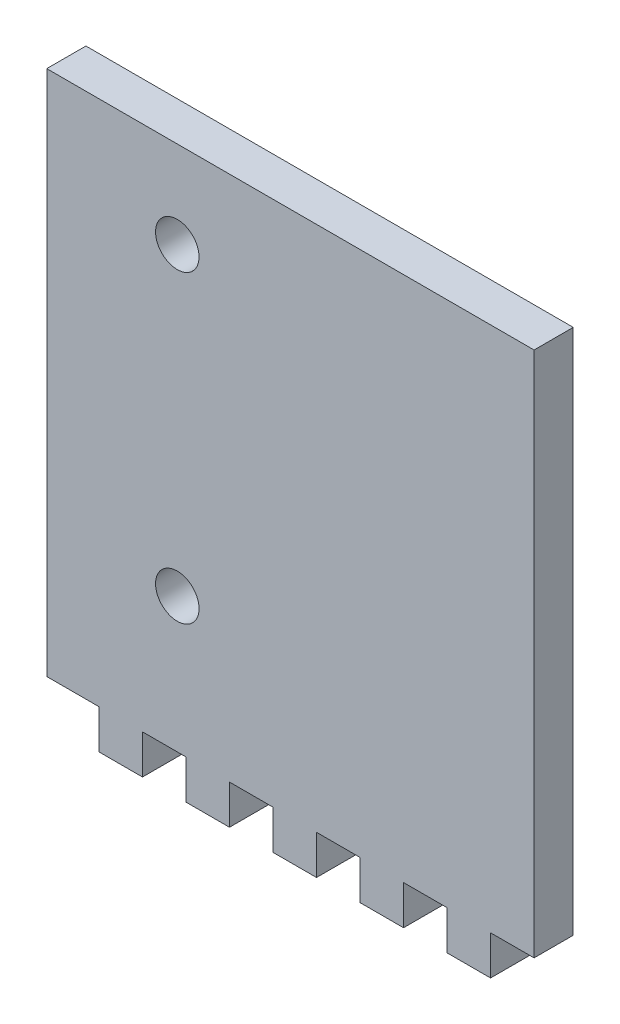
ISO-10303-21;
HEADER;
FILE_DESCRIPTION(('STEP AP214'),'2;1');
FILE_NAME('part.step','',(''),(''),'','','');
FILE_SCHEMA(('AUTOMOTIVE_DESIGN { 1 0 10303 214 1 1 1 1 }'));
ENDSEC;
DATA;
#1=APPLICATION_CONTEXT('core data for automotive mechanical design processes');
#2=APPLICATION_PROTOCOL_DEFINITION('international standard','automotive_design',2000,#1);
#3=PRODUCT_CONTEXT('',#1,'mechanical');
#4=PRODUCT('Part','Part','',(#3));
#5=PRODUCT_RELATED_PRODUCT_CATEGORY('part','',(#4));
#6=PRODUCT_DEFINITION_FORMATION('','',#4);
#7=PRODUCT_DEFINITION_CONTEXT('part definition',#1,'design');
#8=PRODUCT_DEFINITION('design','',#6,#7);
#9=PRODUCT_DEFINITION_SHAPE('','',#8);
#10=(LENGTH_UNIT() NAMED_UNIT(*) SI_UNIT(.MILLI.,.METRE.));
#11=(NAMED_UNIT(*) PLANE_ANGLE_UNIT() SI_UNIT($,.RADIAN.));
#12=(NAMED_UNIT(*) SI_UNIT($,.STERADIAN.) SOLID_ANGLE_UNIT());
#13=UNCERTAINTY_MEASURE_WITH_UNIT(LENGTH_MEASURE(1.E-05),#10,'distance_accuracy_value','');
#14=(GEOMETRIC_REPRESENTATION_CONTEXT(3) GLOBAL_UNCERTAINTY_ASSIGNED_CONTEXT((#13)) GLOBAL_UNIT_ASSIGNED_CONTEXT((#10,
#11,#12)) REPRESENTATION_CONTEXT('',''));
#15=CARTESIAN_POINT('',(0.,0.,0.));
#16=DIRECTION('',(0.,0.,1.));
#17=DIRECTION('',(1.,0.,0.));
#18=AXIS2_PLACEMENT_3D('',#15,#16,#17);
#19=CARTESIAN_POINT('',(0.,-6.11482810737602,4.5));
#20=DIRECTION('',(0.,1.,0.));
#21=DIRECTION('',(-1.,0.,0.));
#22=AXIS2_PLACEMENT_3D('',#19,#20,#21);
#23=PLANE('',#22);
#24=DIRECTION('',(1.,0.,0.));
#25=VECTOR('',#24,1.);
#26=CARTESIAN_POINT('',(0.,-6.11482810737602,0.));
#27=LINE('',#26,#25);
#28=CARTESIAN_POINT('',(-111.932160422542,-6.11482810737599,0.));
#29=VERTEX_POINT('',#28);
#30=CARTESIAN_POINT('',(-106.932160422542,-6.11482810737599,0.));
#31=VERTEX_POINT('',#30);
#32=EDGE_CURVE('E234',#29,#31,#27,.T.);
#33=ORIENTED_EDGE('',*,*,#32,.T.);
#34=DIRECTION('',(0.,0.,-1.));
#35=VECTOR('',#34,1.);
#36=CARTESIAN_POINT('',(-106.932160422542,-6.11482810737599,4.5));
#37=LINE('',#36,#35);
#38=CARTESIAN_POINT('',(-106.932160422542,-6.11482810737599,4.5));
#39=VERTEX_POINT('',#38);
#40=EDGE_CURVE('E11',#39,#31,#37,.T.);
#41=ORIENTED_EDGE('',*,*,#40,.F.);
#42=DIRECTION('',(1.,0.,0.));
#43=VECTOR('',#42,1.);
#44=CARTESIAN_POINT('',(0.,-6.11482810737602,4.5));
#45=LINE('',#44,#43);
#46=CARTESIAN_POINT('',(-111.932160422542,-6.11482810737599,4.5));
#47=VERTEX_POINT('',#46);
#48=EDGE_CURVE('E722',#47,#39,#45,.T.);
#49=ORIENTED_EDGE('',*,*,#48,.F.);
#50=DIRECTION('',(0.,0.,-1.));
#51=VECTOR('',#50,1.);
#52=CARTESIAN_POINT('',(-111.932160422542,-6.11482810737599,4.5));
#53=LINE('',#52,#51);
#54=EDGE_CURVE('E51',#47,#29,#53,.T.);
#55=ORIENTED_EDGE('',*,*,#54,.T.);
#56=EDGE_LOOP('',(#33,#41,#49,#55));
#57=FACE_BOUND('',#56,.T.);
#58=ADVANCED_FACE('F34',(#57),#23,.F.);
#59=CARTESIAN_POINT('',(-106.932160422542,6.59547480966769E-13,4.5));
#60=DIRECTION('',(-1.,0.,0.));
#61=DIRECTION('',(0.,-1.,0.));
#62=AXIS2_PLACEMENT_3D('',#59,#60,#61);
#63=PLANE('',#62);
#64=DIRECTION('',(0.,1.,0.));
#65=VECTOR('',#64,1.);
#66=CARTESIAN_POINT('',(-106.932160422542,6.59547480966769E-13,0.));
#67=LINE('',#66,#65);
#68=CARTESIAN_POINT('',(-106.932160422542,-1.61482810737602,0.));
#69=VERTEX_POINT('',#68);
#70=EDGE_CURVE('E236',#31,#69,#67,.T.);
#71=ORIENTED_EDGE('',*,*,#70,.T.);
#72=DIRECTION('',(0.,0.,-1.));
#73=VECTOR('',#72,1.);
#74=CARTESIAN_POINT('',(-106.932160422542,-1.61482810737602,4.5));
#75=LINE('',#74,#73);
#76=CARTESIAN_POINT('',(-106.932160422542,-1.61482810737602,4.5));
#77=VERTEX_POINT('',#76);
#78=EDGE_CURVE('E43',#77,#69,#75,.T.);
#79=ORIENTED_EDGE('',*,*,#78,.F.);
#80=DIRECTION('',(0.,1.,0.));
#81=VECTOR('',#80,1.);
#82=CARTESIAN_POINT('',(-106.932160422542,6.59547480966769E-13,4.5));
#83=LINE('',#82,#81);
#84=EDGE_CURVE('E137',#39,#77,#83,.T.);
#85=ORIENTED_EDGE('',*,*,#84,.F.);
#86=ORIENTED_EDGE('',*,*,#40,.T.);
#87=EDGE_LOOP('',(#71,#79,#85,#86));
#88=FACE_BOUND('',#87,.T.);
#89=ADVANCED_FACE('F473',(#88),#63,.F.);
#90=CARTESIAN_POINT('',(0.,-1.61482810737599,4.5));
#91=DIRECTION('',(0.,1.,0.));
#92=DIRECTION('',(-1.,0.,0.));
#93=AXIS2_PLACEMENT_3D('',#90,#91,#92);
#94=PLANE('',#93);
#95=DIRECTION('',(1.,0.,0.));
#96=VECTOR('',#95,1.);
#97=CARTESIAN_POINT('',(0.,-1.61482810737599,0.));
#98=LINE('',#97,#96);
#99=CARTESIAN_POINT('',(-101.932160422542,-1.61482810737602,0.));
#100=VERTEX_POINT('',#99);
#101=EDGE_CURVE('E238',#69,#100,#98,.T.);
#102=ORIENTED_EDGE('',*,*,#101,.T.);
#103=DIRECTION('',(0.,0.,-1.));
#104=VECTOR('',#103,1.);
#105=CARTESIAN_POINT('',(-101.932160422542,-1.61482810737602,4.5));
#106=LINE('',#105,#104);
#107=CARTESIAN_POINT('',(-101.932160422542,-1.61482810737602,4.5));
#108=VERTEX_POINT('',#107);
#109=EDGE_CURVE('E331',#108,#100,#106,.T.);
#110=ORIENTED_EDGE('',*,*,#109,.F.);
#111=DIRECTION('',(1.,0.,0.));
#112=VECTOR('',#111,1.);
#113=CARTESIAN_POINT('',(0.,-1.61482810737599,4.5));
#114=LINE('',#113,#112);
#115=EDGE_CURVE('E338',#77,#108,#114,.T.);
#116=ORIENTED_EDGE('',*,*,#115,.F.);
#117=ORIENTED_EDGE('',*,*,#78,.T.);
#118=EDGE_LOOP('',(#102,#110,#116,#117));
#119=FACE_BOUND('',#118,.T.);
#120=ADVANCED_FACE('F336',(#119),#94,.F.);
#121=CARTESIAN_POINT('',(-101.932160422542,3.1435397625248E-13,4.5));
#122=DIRECTION('',(-1.,0.,0.));
#123=DIRECTION('',(0.,-1.,0.));
#124=AXIS2_PLACEMENT_3D('',#121,#122,#123);
#125=PLANE('',#124);
#126=DIRECTION('',(0.,1.,0.));
#127=VECTOR('',#126,1.);
#128=CARTESIAN_POINT('',(-101.932160422542,3.1435397625248E-13,0.));
#129=LINE('',#128,#127);
#130=CARTESIAN_POINT('',(-101.932160422542,-6.11482810737599,0.));
#131=VERTEX_POINT('',#130);
#132=EDGE_CURVE('E241',#131,#100,#129,.T.);
#133=ORIENTED_EDGE('',*,*,#132,.F.);
#134=DIRECTION('',(0.,0.,-1.));
#135=VECTOR('',#134,1.);
#136=CARTESIAN_POINT('',(-101.932160422542,-6.11482810737599,4.5));
#137=LINE('',#136,#135);
#138=CARTESIAN_POINT('',(-101.932160422542,-6.11482810737599,4.5));
#139=VERTEX_POINT('',#138);
#140=EDGE_CURVE('E329',#139,#131,#137,.T.);
#141=ORIENTED_EDGE('',*,*,#140,.F.);
#142=DIRECTION('',(0.,1.,0.));
#143=VECTOR('',#142,1.);
#144=CARTESIAN_POINT('',(-101.932160422542,3.1435397625248E-13,4.5));
#145=LINE('',#144,#143);
#146=EDGE_CURVE('E349',#139,#108,#145,.T.);
#147=ORIENTED_EDGE('',*,*,#146,.T.);
#148=ORIENTED_EDGE('',*,*,#109,.T.);
#149=EDGE_LOOP('',(#133,#141,#147,#148));
#150=FACE_BOUND('',#149,.T.);
#151=ADVANCED_FACE('F345',(#150),#125,.T.);
#152=CARTESIAN_POINT('',(0.,-6.11482810737602,4.5));
#153=DIRECTION('',(0.,1.,0.));
#154=DIRECTION('',(-1.,0.,0.));
#155=AXIS2_PLACEMENT_3D('',#152,#153,#154);
#156=PLANE('',#155);
#157=DIRECTION('',(1.,0.,0.));
#158=VECTOR('',#157,1.);
#159=CARTESIAN_POINT('',(0.,-6.11482810737602,0.));
#160=LINE('',#159,#158);
#161=CARTESIAN_POINT('',(-96.9321604225425,-6.11482810737599,0.));
#162=VERTEX_POINT('',#161);
#163=EDGE_CURVE('E246',#131,#162,#160,.T.);
#164=ORIENTED_EDGE('',*,*,#163,.T.);
#165=DIRECTION('',(0.,0.,-1.));
#166=VECTOR('',#165,1.);
#167=CARTESIAN_POINT('',(-96.9321604225425,-6.11482810737599,4.5));
#168=LINE('',#167,#166);
#169=CARTESIAN_POINT('',(-96.9321604225425,-6.11482810737599,4.5));
#170=VERTEX_POINT('',#169);
#171=EDGE_CURVE('E326',#170,#162,#168,.T.);
#172=ORIENTED_EDGE('',*,*,#171,.F.);
#173=DIRECTION('',(1.,0.,0.));
#174=VECTOR('',#173,1.);
#175=CARTESIAN_POINT('',(0.,-6.11482810737602,4.5));
#176=LINE('',#175,#174);
#177=EDGE_CURVE('E350',#139,#170,#176,.T.);
#178=ORIENTED_EDGE('',*,*,#177,.F.);
#179=ORIENTED_EDGE('',*,*,#140,.T.);
#180=EDGE_LOOP('',(#164,#172,#178,#179));
#181=FACE_BOUND('',#180,.T.);
#182=ADVANCED_FACE('F659',(#181),#156,.F.);
#183=CARTESIAN_POINT('',(-96.9321604225425,2.98934212021575E-13,4.5));
#184=DIRECTION('',(-1.,0.,0.));
#185=DIRECTION('',(0.,-1.,0.));
#186=AXIS2_PLACEMENT_3D('',#183,#184,#185);
#187=PLANE('',#186);
#188=DIRECTION('',(0.,1.,0.));
#189=VECTOR('',#188,1.);
#190=CARTESIAN_POINT('',(-96.9321604225425,2.98934212021575E-13,0.));
#191=LINE('',#190,#189);
#192=CARTESIAN_POINT('',(-96.9321604225425,-1.61482810737602,0.));
#193=VERTEX_POINT('',#192);
#194=EDGE_CURVE('E248',#162,#193,#191,.T.);
#195=ORIENTED_EDGE('',*,*,#194,.T.);
#196=DIRECTION('',(0.,0.,-1.));
#197=VECTOR('',#196,1.);
#198=CARTESIAN_POINT('',(-96.9321604225425,-1.61482810737602,4.5));
#199=LINE('',#198,#197);
#200=CARTESIAN_POINT('',(-96.9321604225425,-1.61482810737602,4.5));
#201=VERTEX_POINT('',#200);
#202=EDGE_CURVE('E323',#201,#193,#199,.T.);
#203=ORIENTED_EDGE('',*,*,#202,.F.);
#204=DIRECTION('',(0.,1.,0.));
#205=VECTOR('',#204,1.);
#206=CARTESIAN_POINT('',(-96.9321604225425,2.98934212021575E-13,4.5));
#207=LINE('',#206,#205);
#208=EDGE_CURVE('E352',#170,#201,#207,.T.);
#209=ORIENTED_EDGE('',*,*,#208,.F.);
#210=ORIENTED_EDGE('',*,*,#171,.T.);
#211=EDGE_LOOP('',(#195,#203,#209,#210));
#212=FACE_BOUND('',#211,.T.);
#213=ADVANCED_FACE('F651',(#212),#187,.F.);
#214=CARTESIAN_POINT('',(-91.9321604225425,-1.61482810737602,0.));
#215=VERTEX_POINT('',#214);
#216=EDGE_CURVE('E243',#193,#215,#98,.T.);
#217=ORIENTED_EDGE('',*,*,#216,.T.);
#218=DIRECTION('',(0.,0.,-1.));
#219=VECTOR('',#218,1.);
#220=CARTESIAN_POINT('',(-91.9321604225425,-1.61482810737602,4.5));
#221=LINE('',#220,#219);
#222=CARTESIAN_POINT('',(-91.9321604225425,-1.61482810737602,4.5));
#223=VERTEX_POINT('',#222);
#224=EDGE_CURVE('E321',#223,#215,#221,.T.);
#225=ORIENTED_EDGE('',*,*,#224,.F.);
#226=EDGE_CURVE('E356',#201,#223,#114,.T.);
#227=ORIENTED_EDGE('',*,*,#226,.F.);
#228=ORIENTED_EDGE('',*,*,#202,.T.);
#229=EDGE_LOOP('',(#217,#225,#227,#228));
#230=FACE_BOUND('',#229,.T.);
#231=ADVANCED_FACE('F401',(#230),#94,.F.);
#232=CARTESIAN_POINT('',(-91.9321604225425,2.8351444779067E-13,4.5));
#233=DIRECTION('',(-1.,0.,0.));
#234=DIRECTION('',(0.,-1.,0.));
#235=AXIS2_PLACEMENT_3D('',#232,#233,#234);
#236=PLANE('',#235);
#237=DIRECTION('',(0.,1.,0.));
#238=VECTOR('',#237,1.);
#239=CARTESIAN_POINT('',(-91.9321604225425,2.8351444779067E-13,0.));
#240=LINE('',#239,#238);
#241=CARTESIAN_POINT('',(-91.9321604225425,-6.11482810737599,0.));
#242=VERTEX_POINT('',#241);
#243=EDGE_CURVE('E250',#242,#215,#240,.T.);
#244=ORIENTED_EDGE('',*,*,#243,.F.);
#245=DIRECTION('',(0.,0.,-1.));
#246=VECTOR('',#245,1.);
#247=CARTESIAN_POINT('',(-91.9321604225425,-6.11482810737599,4.5));
#248=LINE('',#247,#246);
#249=CARTESIAN_POINT('',(-91.9321604225425,-6.11482810737599,4.5));
#250=VERTEX_POINT('',#249);
#251=EDGE_CURVE('E319',#250,#242,#248,.T.);
#252=ORIENTED_EDGE('',*,*,#251,.F.);
#253=DIRECTION('',(0.,1.,0.));
#254=VECTOR('',#253,1.);
#255=CARTESIAN_POINT('',(-91.9321604225425,2.8351444779067E-13,4.5));
#256=LINE('',#255,#254);
#257=EDGE_CURVE('E360',#250,#223,#256,.T.);
#258=ORIENTED_EDGE('',*,*,#257,.T.);
#259=ORIENTED_EDGE('',*,*,#224,.T.);
#260=EDGE_LOOP('',(#244,#252,#258,#259));
#261=FACE_BOUND('',#260,.T.);
#262=ADVANCED_FACE('F405',(#261),#236,.T.);
#263=CARTESIAN_POINT('',(0.,-6.11482810737602,4.5));
#264=DIRECTION('',(0.,1.,0.));
#265=DIRECTION('',(-1.,0.,0.));
#266=AXIS2_PLACEMENT_3D('',#263,#264,#265);
#267=PLANE('',#266);
#268=DIRECTION('',(1.,0.,0.));
#269=VECTOR('',#268,1.);
#270=CARTESIAN_POINT('',(0.,-6.11482810737602,0.));
#271=LINE('',#270,#269);
#272=CARTESIAN_POINT('',(-86.9321604225425,-6.11482810737599,0.));
#273=VERTEX_POINT('',#272);
#274=EDGE_CURVE('E253',#242,#273,#271,.T.);
#275=ORIENTED_EDGE('',*,*,#274,.T.);
#276=DIRECTION('',(0.,0.,-1.));
#277=VECTOR('',#276,1.);
#278=CARTESIAN_POINT('',(-86.9321604225425,-6.11482810737599,4.5));
#279=LINE('',#278,#277);
#280=CARTESIAN_POINT('',(-86.9321604225425,-6.11482810737599,4.5));
#281=VERTEX_POINT('',#280);
#282=EDGE_CURVE('E316',#281,#273,#279,.T.);
#283=ORIENTED_EDGE('',*,*,#282,.F.);
#284=DIRECTION('',(1.,0.,0.));
#285=VECTOR('',#284,1.);
#286=CARTESIAN_POINT('',(0.,-6.11482810737602,4.5));
#287=LINE('',#286,#285);
#288=EDGE_CURVE('E363',#250,#281,#287,.T.);
#289=ORIENTED_EDGE('',*,*,#288,.F.);
#290=ORIENTED_EDGE('',*,*,#251,.T.);
#291=EDGE_LOOP('',(#275,#283,#289,#290));
#292=FACE_BOUND('',#291,.T.);
#293=ADVANCED_FACE('F410',(#292),#267,.F.);
#294=CARTESIAN_POINT('',(-86.9321604225425,2.68094683559764E-13,4.5));
#295=DIRECTION('',(-1.,0.,0.));
#296=DIRECTION('',(0.,-1.,0.));
#297=AXIS2_PLACEMENT_3D('',#294,#295,#296);
#298=PLANE('',#297);
#299=DIRECTION('',(0.,1.,0.));
#300=VECTOR('',#299,1.);
#301=CARTESIAN_POINT('',(-86.9321604225425,2.68094683559764E-13,0.));
#302=LINE('',#301,#300);
#303=CARTESIAN_POINT('',(-86.9321604225425,-1.61482810737602,0.));
#304=VERTEX_POINT('',#303);
#305=EDGE_CURVE('E255',#273,#304,#302,.T.);
#306=ORIENTED_EDGE('',*,*,#305,.T.);
#307=DIRECTION('',(0.,0.,-1.));
#308=VECTOR('',#307,1.);
#309=CARTESIAN_POINT('',(-86.9321604225425,-1.61482810737602,4.5));
#310=LINE('',#309,#308);
#311=CARTESIAN_POINT('',(-86.9321604225425,-1.61482810737602,4.5));
#312=VERTEX_POINT('',#311);
#313=EDGE_CURVE('E313',#312,#304,#310,.T.);
#314=ORIENTED_EDGE('',*,*,#313,.F.);
#315=DIRECTION('',(0.,1.,0.));
#316=VECTOR('',#315,1.);
#317=CARTESIAN_POINT('',(-86.9321604225425,2.68094683559764E-13,4.5));
#318=LINE('',#317,#316);
#319=EDGE_CURVE('E365',#281,#312,#318,.T.);
#320=ORIENTED_EDGE('',*,*,#319,.F.);
#321=ORIENTED_EDGE('',*,*,#282,.T.);
#322=EDGE_LOOP('',(#306,#314,#320,#321));
#323=FACE_BOUND('',#322,.T.);
#324=ADVANCED_FACE('F414',(#323),#298,.F.);
#325=CARTESIAN_POINT('',(-81.9321604225425,-1.61482810737602,0.));
#326=VERTEX_POINT('',#325);
#327=EDGE_CURVE('E257',#304,#326,#98,.T.);
#328=ORIENTED_EDGE('',*,*,#327,.T.);
#329=DIRECTION('',(0.,0.,-1.));
#330=VECTOR('',#329,1.);
#331=CARTESIAN_POINT('',(-81.9321604225425,-1.61482810737602,4.5));
#332=LINE('',#331,#330);
#333=CARTESIAN_POINT('',(-81.9321604225425,-1.61482810737602,4.5));
#334=VERTEX_POINT('',#333);
#335=EDGE_CURVE('E311',#334,#326,#332,.T.);
#336=ORIENTED_EDGE('',*,*,#335,.F.);
#337=EDGE_CURVE('E367',#312,#334,#114,.T.);
#338=ORIENTED_EDGE('',*,*,#337,.F.);
#339=ORIENTED_EDGE('',*,*,#313,.T.);
#340=EDGE_LOOP('',(#328,#336,#338,#339));
#341=FACE_BOUND('',#340,.T.);
#342=ADVANCED_FACE('F419',(#341),#94,.F.);
#343=CARTESIAN_POINT('',(-81.9321604225425,0.,4.5));
#344=DIRECTION('',(-1.,0.,0.));
#345=DIRECTION('',(0.,0.,1.));
#346=AXIS2_PLACEMENT_3D('',#343,#344,#345);
#347=PLANE('',#346);
#348=DIRECTION('',(0.,1.,0.));
#349=VECTOR('',#348,1.);
#350=CARTESIAN_POINT('',(-81.9321604225425,0.,0.));
#351=LINE('',#350,#349);
#352=CARTESIAN_POINT('',(-81.9321604225425,-6.11482810737599,0.));
#353=VERTEX_POINT('',#352);
#354=EDGE_CURVE('E258',#353,#326,#351,.T.);
#355=ORIENTED_EDGE('',*,*,#354,.F.);
#356=DIRECTION('',(0.,0.,-1.));
#357=VECTOR('',#356,1.);
#358=CARTESIAN_POINT('',(-81.9321604225425,-6.11482810737599,4.5));
#359=LINE('',#358,#357);
#360=CARTESIAN_POINT('',(-81.9321604225425,-6.11482810737599,4.5));
#361=VERTEX_POINT('',#360);
#362=EDGE_CURVE('E309',#361,#353,#359,.T.);
#363=ORIENTED_EDGE('',*,*,#362,.F.);
#364=DIRECTION('',(0.,1.,0.));
#365=VECTOR('',#364,1.);
#366=CARTESIAN_POINT('',(-81.9321604225425,0.,4.5));
#367=LINE('',#366,#365);
#368=EDGE_CURVE('E368',#361,#334,#367,.T.);
#369=ORIENTED_EDGE('',*,*,#368,.T.);
#370=ORIENTED_EDGE('',*,*,#335,.T.);
#371=EDGE_LOOP('',(#355,#363,#369,#370));
#372=FACE_BOUND('',#371,.T.);
#373=ADVANCED_FACE('F422',(#372),#347,.T.);
#374=CARTESIAN_POINT('',(0.,-6.11482810737602,4.5));
#375=DIRECTION('',(0.,1.,0.));
#376=DIRECTION('',(-1.,0.,0.));
#377=AXIS2_PLACEMENT_3D('',#374,#375,#376);
#378=PLANE('',#377);
#379=DIRECTION('',(1.,0.,0.));
#380=VECTOR('',#379,1.);
#381=CARTESIAN_POINT('',(0.,-6.11482810737602,0.));
#382=LINE('',#381,#380);
#383=CARTESIAN_POINT('',(-76.9321604225425,-6.114828107376,0.));
#384=VERTEX_POINT('',#383);
#385=EDGE_CURVE('E261',#353,#384,#382,.T.);
#386=ORIENTED_EDGE('',*,*,#385,.T.);
#387=DIRECTION('',(0.,0.,-1.));
#388=VECTOR('',#387,1.);
#389=CARTESIAN_POINT('',(-76.9321604225425,-6.114828107376,4.5));
#390=LINE('',#389,#388);
#391=CARTESIAN_POINT('',(-76.9321604225425,-6.114828107376,4.5));
#392=VERTEX_POINT('',#391);
#393=EDGE_CURVE('E306',#392,#384,#390,.T.);
#394=ORIENTED_EDGE('',*,*,#393,.F.);
#395=DIRECTION('',(1.,0.,0.));
#396=VECTOR('',#395,1.);
#397=CARTESIAN_POINT('',(0.,-6.11482810737602,4.5));
#398=LINE('',#397,#396);
#399=EDGE_CURVE('E371',#361,#392,#398,.T.);
#400=ORIENTED_EDGE('',*,*,#399,.F.);
#401=ORIENTED_EDGE('',*,*,#362,.T.);
#402=EDGE_LOOP('',(#386,#394,#400,#401));
#403=FACE_BOUND('',#402,.T.);
#404=ADVANCED_FACE('F428',(#403),#378,.F.);
#405=CARTESIAN_POINT('',(-76.9321604225425,0.,4.5));
#406=DIRECTION('',(-1.,0.,0.));
#407=DIRECTION('',(0.,0.,1.));
#408=AXIS2_PLACEMENT_3D('',#405,#406,#407);
#409=PLANE('',#408);
#410=DIRECTION('',(0.,1.,0.));
#411=VECTOR('',#410,1.);
#412=CARTESIAN_POINT('',(-76.9321604225425,0.,0.));
#413=LINE('',#412,#411);
#414=CARTESIAN_POINT('',(-76.9321604225425,-1.61482810737601,0.));
#415=VERTEX_POINT('',#414);
#416=EDGE_CURVE('E263',#384,#415,#413,.T.);
#417=ORIENTED_EDGE('',*,*,#416,.T.);
#418=DIRECTION('',(0.,0.,-1.));
#419=VECTOR('',#418,1.);
#420=CARTESIAN_POINT('',(-76.9321604225425,-1.61482810737601,4.5));
#421=LINE('',#420,#419);
#422=CARTESIAN_POINT('',(-76.9321604225425,-1.61482810737601,4.5));
#423=VERTEX_POINT('',#422);
#424=EDGE_CURVE('E303',#423,#415,#421,.T.);
#425=ORIENTED_EDGE('',*,*,#424,.F.);
#426=DIRECTION('',(0.,1.,0.));
#427=VECTOR('',#426,1.);
#428=CARTESIAN_POINT('',(-76.9321604225425,0.,4.5));
#429=LINE('',#428,#427);
#430=EDGE_CURVE('E373',#392,#423,#429,.T.);
#431=ORIENTED_EDGE('',*,*,#430,.F.);
#432=ORIENTED_EDGE('',*,*,#393,.T.);
#433=EDGE_LOOP('',(#417,#425,#431,#432));
#434=FACE_BOUND('',#433,.T.);
#435=ADVANCED_FACE('F432',(#434),#409,.F.);
#436=CARTESIAN_POINT('',(-71.9321604225426,-1.61482810737601,0.));
#437=VERTEX_POINT('',#436);
#438=EDGE_CURVE('E265',#415,#437,#98,.T.);
#439=ORIENTED_EDGE('',*,*,#438,.T.);
#440=DIRECTION('',(0.,0.,-1.));
#441=VECTOR('',#440,1.);
#442=CARTESIAN_POINT('',(-71.9321604225426,-1.61482810737601,4.5));
#443=LINE('',#442,#441);
#444=CARTESIAN_POINT('',(-71.9321604225426,-1.61482810737601,4.5));
#445=VERTEX_POINT('',#444);
#446=EDGE_CURVE('E301',#445,#437,#443,.T.);
#447=ORIENTED_EDGE('',*,*,#446,.F.);
#448=EDGE_CURVE('E375',#423,#445,#114,.T.);
#449=ORIENTED_EDGE('',*,*,#448,.F.);
#450=ORIENTED_EDGE('',*,*,#424,.T.);
#451=EDGE_LOOP('',(#439,#447,#449,#450));
#452=FACE_BOUND('',#451,.T.);
#453=ADVANCED_FACE('F436',(#452),#94,.F.);
#454=CARTESIAN_POINT('',(-71.9321604225426,0.,4.5));
#455=DIRECTION('',(-1.,0.,0.));
#456=DIRECTION('',(0.,0.,1.));
#457=AXIS2_PLACEMENT_3D('',#454,#455,#456);
#458=PLANE('',#457);
#459=DIRECTION('',(0.,1.,0.));
#460=VECTOR('',#459,1.);
#461=CARTESIAN_POINT('',(-71.9321604225426,0.,0.));
#462=LINE('',#461,#460);
#463=CARTESIAN_POINT('',(-71.9321604225426,-6.114828107376,0.));
#464=VERTEX_POINT('',#463);
#465=EDGE_CURVE('E266',#464,#437,#462,.T.);
#466=ORIENTED_EDGE('',*,*,#465,.F.);
#467=DIRECTION('',(0.,0.,-1.));
#468=VECTOR('',#467,1.);
#469=CARTESIAN_POINT('',(-71.9321604225426,-6.114828107376,4.5));
#470=LINE('',#469,#468);
#471=CARTESIAN_POINT('',(-71.9321604225426,-6.114828107376,4.5));
#472=VERTEX_POINT('',#471);
#473=EDGE_CURVE('E299',#472,#464,#470,.T.);
#474=ORIENTED_EDGE('',*,*,#473,.F.);
#475=DIRECTION('',(0.,1.,0.));
#476=VECTOR('',#475,1.);
#477=CARTESIAN_POINT('',(-71.9321604225426,0.,4.5));
#478=LINE('',#477,#476);
#479=EDGE_CURVE('E376',#472,#445,#478,.T.);
#480=ORIENTED_EDGE('',*,*,#479,.T.);
#481=ORIENTED_EDGE('',*,*,#446,.T.);
#482=EDGE_LOOP('',(#466,#474,#480,#481));
#483=FACE_BOUND('',#482,.T.);
#484=ADVANCED_FACE('F439',(#483),#458,.T.);
#485=CARTESIAN_POINT('',(0.,-6.11482810737602,4.5));
#486=DIRECTION('',(0.,1.,0.));
#487=DIRECTION('',(-1.,0.,0.));
#488=AXIS2_PLACEMENT_3D('',#485,#486,#487);
#489=PLANE('',#488);
#490=DIRECTION('',(1.,0.,0.));
#491=VECTOR('',#490,1.);
#492=CARTESIAN_POINT('',(0.,-6.11482810737602,0.));
#493=LINE('',#492,#491);
#494=CARTESIAN_POINT('',(-66.9321604225426,-6.114828107376,0.));
#495=VERTEX_POINT('',#494);
#496=EDGE_CURVE('E269',#464,#495,#493,.T.);
#497=ORIENTED_EDGE('',*,*,#496,.T.);
#498=DIRECTION('',(0.,0.,-1.));
#499=VECTOR('',#498,1.);
#500=CARTESIAN_POINT('',(-66.9321604225426,-6.114828107376,4.5));
#501=LINE('',#500,#499);
#502=CARTESIAN_POINT('',(-66.9321604225426,-6.114828107376,4.5));
#503=VERTEX_POINT('',#502);
#504=EDGE_CURVE('E296',#503,#495,#501,.T.);
#505=ORIENTED_EDGE('',*,*,#504,.F.);
#506=DIRECTION('',(1.,0.,0.));
#507=VECTOR('',#506,1.);
#508=CARTESIAN_POINT('',(0.,-6.11482810737602,4.5));
#509=LINE('',#508,#507);
#510=EDGE_CURVE('E379',#472,#503,#509,.T.);
#511=ORIENTED_EDGE('',*,*,#510,.F.);
#512=ORIENTED_EDGE('',*,*,#473,.T.);
#513=EDGE_LOOP('',(#497,#505,#511,#512));
#514=FACE_BOUND('',#513,.T.);
#515=ADVANCED_FACE('F445',(#514),#489,.F.);
#516=CARTESIAN_POINT('',(-66.9321604225426,2.06415626636143E-13,4.5));
#517=DIRECTION('',(-1.,0.,0.));
#518=DIRECTION('',(0.,-1.,0.));
#519=AXIS2_PLACEMENT_3D('',#516,#517,#518);
#520=PLANE('',#519);
#521=DIRECTION('',(0.,1.,0.));
#522=VECTOR('',#521,1.);
#523=CARTESIAN_POINT('',(-66.9321604225426,2.06415626636143E-13,0.));
#524=LINE('',#523,#522);
#525=CARTESIAN_POINT('',(-66.9321604225426,-1.61482810737601,0.));
#526=VERTEX_POINT('',#525);
#527=EDGE_CURVE('E271',#495,#526,#524,.T.);
#528=ORIENTED_EDGE('',*,*,#527,.T.);
#529=DIRECTION('',(0.,0.,-1.));
#530=VECTOR('',#529,1.);
#531=CARTESIAN_POINT('',(-66.9321604225426,-1.61482810737601,4.5));
#532=LINE('',#531,#530);
#533=CARTESIAN_POINT('',(-66.9321604225426,-1.61482810737601,4.5));
#534=VERTEX_POINT('',#533);
#535=EDGE_CURVE('E293',#534,#526,#532,.T.);
#536=ORIENTED_EDGE('',*,*,#535,.F.);
#537=DIRECTION('',(0.,1.,0.));
#538=VECTOR('',#537,1.);
#539=CARTESIAN_POINT('',(-66.9321604225426,2.06415626636143E-13,4.5));
#540=LINE('',#539,#538);
#541=EDGE_CURVE('E381',#503,#534,#540,.T.);
#542=ORIENTED_EDGE('',*,*,#541,.F.);
#543=ORIENTED_EDGE('',*,*,#504,.T.);
#544=EDGE_LOOP('',(#528,#536,#542,#543));
#545=FACE_BOUND('',#544,.T.);
#546=ADVANCED_FACE('F449',(#545),#520,.F.);
#547=CARTESIAN_POINT('',(-61.9321604225425,-1.61482810737602,0.));
#548=VERTEX_POINT('',#547);
#549=EDGE_CURVE('E242',#526,#548,#98,.T.);
#550=ORIENTED_EDGE('',*,*,#549,.T.);
#551=DIRECTION('',(0.,0.,-1.));
#552=VECTOR('',#551,1.);
#553=CARTESIAN_POINT('',(-61.9321604225425,-1.61482810737602,4.5));
#554=LINE('',#553,#552);
#555=CARTESIAN_POINT('',(-61.9321604225425,-1.61482810737602,4.5));
#556=VERTEX_POINT('',#555);
#557=EDGE_CURVE('E290',#556,#548,#554,.T.);
#558=ORIENTED_EDGE('',*,*,#557,.F.);
#559=EDGE_CURVE('E355',#534,#556,#114,.T.);
#560=ORIENTED_EDGE('',*,*,#559,.F.);
#561=ORIENTED_EDGE('',*,*,#535,.T.);
#562=EDGE_LOOP('',(#550,#558,#560,#561));
#563=FACE_BOUND('',#562,.T.);
#564=ADVANCED_FACE('F452',(#563),#94,.F.);
#565=CARTESIAN_POINT('',(-61.9321604225425,0.,4.5));
#566=DIRECTION('',(-1.,0.,0.));
#567=DIRECTION('',(0.,-1.,0.));
#568=AXIS2_PLACEMENT_3D('',#565,#566,#567);
#569=PLANE('',#568);
#570=DIRECTION('',(0.,1.,0.));
#571=VECTOR('',#570,1.);
#572=CARTESIAN_POINT('',(-61.9321604225425,0.,0.));
#573=LINE('',#572,#571);
#574=CARTESIAN_POINT('',(-61.9321604225426,58.885171892624,0.));
#575=VERTEX_POINT('',#574);
#576=EDGE_CURVE('E273',#548,#575,#573,.T.);
#577=ORIENTED_EDGE('',*,*,#576,.T.);
#578=DIRECTION('',(0.,0.,-1.));
#579=VECTOR('',#578,1.);
#580=CARTESIAN_POINT('',(-61.9321604225426,58.885171892624,4.5));
#581=LINE('',#580,#579);
#582=CARTESIAN_POINT('',(-61.9321604225426,58.885171892624,4.5));
#583=VERTEX_POINT('',#582);
#584=EDGE_CURVE('E287',#583,#575,#581,.T.);
#585=ORIENTED_EDGE('',*,*,#584,.F.);
#586=DIRECTION('',(0.,1.,0.));
#587=VECTOR('',#586,1.);
#588=CARTESIAN_POINT('',(-61.9321604225425,0.,4.5));
#589=LINE('',#588,#587);
#590=EDGE_CURVE('E383',#556,#583,#589,.T.);
#591=ORIENTED_EDGE('',*,*,#590,.F.);
#592=ORIENTED_EDGE('',*,*,#557,.T.);
#593=EDGE_LOOP('',(#577,#585,#591,#592));
#594=FACE_BOUND('',#593,.T.);
#595=ADVANCED_FACE('F455',(#594),#569,.F.);
#596=CARTESIAN_POINT('',(0.,58.885171892624,4.5));
#597=DIRECTION('',(0.,-1.,0.));
#598=DIRECTION('',(0.,0.,-1.));
#599=AXIS2_PLACEMENT_3D('',#596,#597,#598);
#600=PLANE('',#599);
#601=DIRECTION('',(-1.,0.,0.));
#602=VECTOR('',#601,1.);
#603=CARTESIAN_POINT('',(0.,58.885171892624,0.));
#604=LINE('',#603,#602);
#605=CARTESIAN_POINT('',(-117.932160422543,58.885171892624,0.));
#606=VERTEX_POINT('',#605);
#607=EDGE_CURVE('E275',#575,#606,#604,.T.);
#608=ORIENTED_EDGE('',*,*,#607,.T.);
#609=DIRECTION('',(0.,0.,-1.));
#610=VECTOR('',#609,1.);
#611=CARTESIAN_POINT('',(-117.932160422543,58.885171892624,4.5));
#612=LINE('',#611,#610);
#613=CARTESIAN_POINT('',(-117.932160422543,58.885171892624,4.5));
#614=VERTEX_POINT('',#613);
#615=EDGE_CURVE('E220',#614,#606,#612,.T.);
#616=ORIENTED_EDGE('',*,*,#615,.F.);
#617=DIRECTION('',(-1.,0.,0.));
#618=VECTOR('',#617,1.);
#619=CARTESIAN_POINT('',(0.,58.885171892624,4.5));
#620=LINE('',#619,#618);
#621=EDGE_CURVE('E208',#583,#614,#620,.T.);
#622=ORIENTED_EDGE('',*,*,#621,.F.);
#623=ORIENTED_EDGE('',*,*,#584,.T.);
#624=EDGE_LOOP('',(#608,#616,#622,#623));
#625=FACE_BOUND('',#624,.T.);
#626=ADVANCED_FACE('F458',(#625),#600,.F.);
#627=CARTESIAN_POINT('',(-117.932160422543,0.,4.5));
#628=DIRECTION('',(1.,0.,0.));
#629=DIRECTION('',(0.,0.,-1.));
#630=AXIS2_PLACEMENT_3D('',#627,#628,#629);
#631=PLANE('',#630);
#632=DIRECTION('',(0.,-1.,0.));
#633=VECTOR('',#632,1.);
#634=CARTESIAN_POINT('',(-117.932160422543,0.,0.));
#635=LINE('',#634,#633);
#636=CARTESIAN_POINT('',(-117.932160422543,-1.61482810737602,0.));
#637=VERTEX_POINT('',#636);
#638=EDGE_CURVE('E217',#606,#637,#635,.T.);
#639=ORIENTED_EDGE('',*,*,#638,.T.);
#640=DIRECTION('',(0.,0.,-1.));
#641=VECTOR('',#640,1.);
#642=CARTESIAN_POINT('',(-117.932160422543,-1.61482810737602,4.5));
#643=LINE('',#642,#641);
#644=CARTESIAN_POINT('',(-117.932160422543,-1.61482810737602,4.5));
#645=VERTEX_POINT('',#644);
#646=EDGE_CURVE('E214',#645,#637,#643,.T.);
#647=ORIENTED_EDGE('',*,*,#646,.F.);
#648=DIRECTION('',(0.,-1.,0.));
#649=VECTOR('',#648,1.);
#650=CARTESIAN_POINT('',(-117.932160422543,0.,4.5));
#651=LINE('',#650,#649);
#652=EDGE_CURVE('E201',#614,#645,#651,.T.);
#653=ORIENTED_EDGE('',*,*,#652,.F.);
#654=ORIENTED_EDGE('',*,*,#615,.T.);
#655=EDGE_LOOP('',(#639,#647,#653,#654));
#656=FACE_BOUND('',#655,.T.);
#657=ADVANCED_FACE('F215',(#656),#631,.F.);
#658=CARTESIAN_POINT('',(0.,-1.61482810737602,4.5));
#659=DIRECTION('',(0.,-1.,0.));
#660=DIRECTION('',(0.,0.,-1.));
#661=AXIS2_PLACEMENT_3D('',#658,#659,#660);
#662=PLANE('',#661);
#663=DIRECTION('',(-1.,0.,0.));
#664=VECTOR('',#663,1.);
#665=CARTESIAN_POINT('',(0.,-1.61482810737602,0.));
#666=LINE('',#665,#664);
#667=CARTESIAN_POINT('',(-111.932160422542,-1.61482810737602,0.));
#668=VERTEX_POINT('',#667);
#669=EDGE_CURVE('E278',#668,#637,#666,.T.);
#670=ORIENTED_EDGE('',*,*,#669,.F.);
#671=DIRECTION('',(0.,0.,-1.));
#672=VECTOR('',#671,1.);
#673=CARTESIAN_POINT('',(-111.932160422542,-1.61482810737602,4.5));
#674=LINE('',#673,#672);
#675=CARTESIAN_POINT('',(-111.932160422542,-1.61482810737602,4.5));
#676=VERTEX_POINT('',#675);
#677=EDGE_CURVE('E125',#676,#668,#674,.T.);
#678=ORIENTED_EDGE('',*,*,#677,.F.);
#679=DIRECTION('',(-1.,0.,0.));
#680=VECTOR('',#679,1.);
#681=CARTESIAN_POINT('',(0.,-1.61482810737602,4.5));
#682=LINE('',#681,#680);
#683=EDGE_CURVE('E206',#676,#645,#682,.T.);
#684=ORIENTED_EDGE('',*,*,#683,.T.);
#685=ORIENTED_EDGE('',*,*,#646,.T.);
#686=EDGE_LOOP('',(#670,#678,#684,#685));
#687=FACE_BOUND('',#686,.T.);
#688=ADVANCED_FACE('F222',(#687),#662,.T.);
#689=CARTESIAN_POINT('',(-102.932160422543,48.885171892624,4.5));
#690=DIRECTION('',(0.,0.,-1.));
#691=DIRECTION('',(-1.,0.,0.));
#692=AXIS2_PLACEMENT_3D('',#689,#690,#691);
#693=CYLINDRICAL_SURFACE('',#692,2.5);
#694=CARTESIAN_POINT('',(-102.932160422543,48.885171892624,4.5));
#695=DIRECTION('',(0.,0.,1.));
#696=DIRECTION('',(1.,0.,0.));
#697=AXIS2_PLACEMENT_3D('',#694,#695,#696);
#698=CIRCLE('',#697,2.5);
#699=CARTESIAN_POINT('',(-100.432160422543,48.885171892624,4.5));
#700=VERTEX_POINT('',#699);
#701=EDGE_CURVE('E488',#700,#700,#698,.T.);
#702=ORIENTED_EDGE('',*,*,#701,.T.);
#703=EDGE_LOOP('',(#702));
#704=FACE_BOUND('',#703,.T.);
#705=CARTESIAN_POINT('',(-102.932160422543,48.885171892624,0.));
#706=DIRECTION('',(0.,0.,1.));
#707=DIRECTION('',(1.,0.,0.));
#708=AXIS2_PLACEMENT_3D('',#705,#706,#707);
#709=CIRCLE('',#708,2.5);
#710=CARTESIAN_POINT('',(-100.432160422543,48.885171892624,0.));
#711=VERTEX_POINT('',#710);
#712=EDGE_CURVE('E231',#711,#711,#709,.T.);
#713=ORIENTED_EDGE('',*,*,#712,.F.);
#714=EDGE_LOOP('',(#713));
#715=FACE_BOUND('',#714,.T.);
#716=ADVANCED_FACE('F468',(#704,#715),#693,.F.);
#717=CARTESIAN_POINT('',(-102.932160422543,13.885171892624,4.5));
#718=DIRECTION('',(0.,0.,-1.));
#719=DIRECTION('',(-1.,0.,0.));
#720=AXIS2_PLACEMENT_3D('',#717,#718,#719);
#721=CYLINDRICAL_SURFACE('',#720,2.50000000000001);
#722=CARTESIAN_POINT('',(-102.932160422543,13.885171892624,4.5));
#723=DIRECTION('',(0.,0.,1.));
#724=DIRECTION('',(1.,0.,0.));
#725=AXIS2_PLACEMENT_3D('',#722,#723,#724);
#726=CIRCLE('',#725,2.50000000000001);
#727=CARTESIAN_POINT('',(-100.432160422543,13.885171892624,4.5));
#728=VERTEX_POINT('',#727);
#729=EDGE_CURVE('E283',#728,#728,#726,.T.);
#730=ORIENTED_EDGE('',*,*,#729,.T.);
#731=EDGE_LOOP('',(#730));
#732=FACE_BOUND('',#731,.T.);
#733=CARTESIAN_POINT('',(-102.932160422543,13.885171892624,0.));
#734=DIRECTION('',(0.,0.,1.));
#735=DIRECTION('',(1.,0.,0.));
#736=AXIS2_PLACEMENT_3D('',#733,#734,#735);
#737=CIRCLE('',#736,2.50000000000001);
#738=CARTESIAN_POINT('',(-100.432160422543,13.885171892624,0.));
#739=VERTEX_POINT('',#738);
#740=EDGE_CURVE('E228',#739,#739,#737,.T.);
#741=ORIENTED_EDGE('',*,*,#740,.F.);
#742=EDGE_LOOP('',(#741));
#743=FACE_BOUND('',#742,.T.);
#744=ADVANCED_FACE('F36',(#732,#743),#721,.F.);
#745=CARTESIAN_POINT('',(-111.932160422542,0.,4.5));
#746=DIRECTION('',(-1.,0.,0.));
#747=DIRECTION('',(0.,0.,1.));
#748=AXIS2_PLACEMENT_3D('',#745,#746,#747);
#749=PLANE('',#748);
#750=DIRECTION('',(0.,1.,0.));
#751=VECTOR('',#750,1.);
#752=CARTESIAN_POINT('',(-111.932160422542,0.,0.));
#753=LINE('',#752,#751);
#754=EDGE_CURVE('E280',#29,#668,#753,.T.);
#755=ORIENTED_EDGE('',*,*,#754,.F.);
#756=ORIENTED_EDGE('',*,*,#54,.F.);
#757=DIRECTION('',(0.,1.,0.));
#758=VECTOR('',#757,1.);
#759=CARTESIAN_POINT('',(-111.932160422542,0.,4.5));
#760=LINE('',#759,#758);
#761=EDGE_CURVE('E223',#47,#676,#760,.T.);
#762=ORIENTED_EDGE('',*,*,#761,.T.);
#763=ORIENTED_EDGE('',*,*,#677,.T.);
#764=EDGE_LOOP('',(#755,#756,#762,#763));
#765=FACE_BOUND('',#764,.T.);
#766=ADVANCED_FACE('F459',(#765),#749,.T.);
#767=CARTESIAN_POINT('',(0.,0.,4.5));
#768=DIRECTION('',(0.,0.,1.));
#769=DIRECTION('',(1.,0.,0.));
#770=AXIS2_PLACEMENT_3D('',#767,#768,#769);
#771=PLANE('',#770);
#772=ORIENTED_EDGE('',*,*,#729,.F.);
#773=EDGE_LOOP('',(#772));
#774=FACE_BOUND('',#773,.T.);
#775=ORIENTED_EDGE('',*,*,#701,.F.);
#776=EDGE_LOOP('',(#775));
#777=FACE_BOUND('',#776,.T.);
#778=ORIENTED_EDGE('',*,*,#48,.T.);
#779=ORIENTED_EDGE('',*,*,#84,.T.);
#780=ORIENTED_EDGE('',*,*,#115,.T.);
#781=ORIENTED_EDGE('',*,*,#146,.F.);
#782=ORIENTED_EDGE('',*,*,#177,.T.);
#783=ORIENTED_EDGE('',*,*,#208,.T.);
#784=ORIENTED_EDGE('',*,*,#226,.T.);
#785=ORIENTED_EDGE('',*,*,#257,.F.);
#786=ORIENTED_EDGE('',*,*,#288,.T.);
#787=ORIENTED_EDGE('',*,*,#319,.T.);
#788=ORIENTED_EDGE('',*,*,#337,.T.);
#789=ORIENTED_EDGE('',*,*,#368,.F.);
#790=ORIENTED_EDGE('',*,*,#399,.T.);
#791=ORIENTED_EDGE('',*,*,#430,.T.);
#792=ORIENTED_EDGE('',*,*,#448,.T.);
#793=ORIENTED_EDGE('',*,*,#479,.F.);
#794=ORIENTED_EDGE('',*,*,#510,.T.);
#795=ORIENTED_EDGE('',*,*,#541,.T.);
#796=ORIENTED_EDGE('',*,*,#559,.T.);
#797=ORIENTED_EDGE('',*,*,#590,.T.);
#798=ORIENTED_EDGE('',*,*,#621,.T.);
#799=ORIENTED_EDGE('',*,*,#652,.T.);
#800=ORIENTED_EDGE('',*,*,#683,.F.);
#801=ORIENTED_EDGE('',*,*,#761,.F.);
#802=EDGE_LOOP('',(#778,#779,#780,#781,#782,#783,#784,#785,#786,#787,#788,#789,#790,#791,#792,
#793,#794,#795,#796,#797,#798,#799,#800,#801));
#803=FACE_BOUND('',#802,.T.);
#804=ADVANCED_FACE('F203',(#774,#777,#803),#771,.T.);
#805=CARTESIAN_POINT('',(0.,0.,0.));
#806=DIRECTION('',(0.,0.,1.));
#807=DIRECTION('',(1.,0.,0.));
#808=AXIS2_PLACEMENT_3D('',#805,#806,#807);
#809=PLANE('',#808);
#810=ORIENTED_EDGE('',*,*,#740,.T.);
#811=EDGE_LOOP('',(#810));
#812=FACE_BOUND('',#811,.T.);
#813=ORIENTED_EDGE('',*,*,#712,.T.);
#814=EDGE_LOOP('',(#813));
#815=FACE_BOUND('',#814,.T.);
#816=ORIENTED_EDGE('',*,*,#32,.F.);
#817=ORIENTED_EDGE('',*,*,#754,.T.);
#818=ORIENTED_EDGE('',*,*,#669,.T.);
#819=ORIENTED_EDGE('',*,*,#638,.F.);
#820=ORIENTED_EDGE('',*,*,#607,.F.);
#821=ORIENTED_EDGE('',*,*,#576,.F.);
#822=ORIENTED_EDGE('',*,*,#549,.F.);
#823=ORIENTED_EDGE('',*,*,#527,.F.);
#824=ORIENTED_EDGE('',*,*,#496,.F.);
#825=ORIENTED_EDGE('',*,*,#465,.T.);
#826=ORIENTED_EDGE('',*,*,#438,.F.);
#827=ORIENTED_EDGE('',*,*,#416,.F.);
#828=ORIENTED_EDGE('',*,*,#385,.F.);
#829=ORIENTED_EDGE('',*,*,#354,.T.);
#830=ORIENTED_EDGE('',*,*,#327,.F.);
#831=ORIENTED_EDGE('',*,*,#305,.F.);
#832=ORIENTED_EDGE('',*,*,#274,.F.);
#833=ORIENTED_EDGE('',*,*,#243,.T.);
#834=ORIENTED_EDGE('',*,*,#216,.F.);
#835=ORIENTED_EDGE('',*,*,#194,.F.);
#836=ORIENTED_EDGE('',*,*,#163,.F.);
#837=ORIENTED_EDGE('',*,*,#132,.T.);
#838=ORIENTED_EDGE('',*,*,#101,.F.);
#839=ORIENTED_EDGE('',*,*,#70,.F.);
#840=EDGE_LOOP('',(#816,#817,#818,#819,#820,#821,#822,#823,#824,#825,#826,#827,#828,#829,#830,
#831,#832,#833,#834,#835,#836,#837,#838,#839));
#841=FACE_BOUND('',#840,.T.);
#842=ADVANCED_FACE('F340',(#812,#815,#841),#809,.F.);
#843=CLOSED_SHELL('',(#58,#89,#120,#151,#182,#213,#231,#262,#293,#324,#342,#373,#404,#435,#453,
#484,#515,#546,#564,#595,#626,#657,#688,#716,#744,#766,#804,#842));
#844=MANIFOLD_SOLID_BREP('B2',#843);
#845=ADVANCED_BREP_SHAPE_REPRESENTATION('',(#18,#844),#14);
#846=SHAPE_DEFINITION_REPRESENTATION(#9,#845);
ENDSEC;
END-ISO-10303-21;
